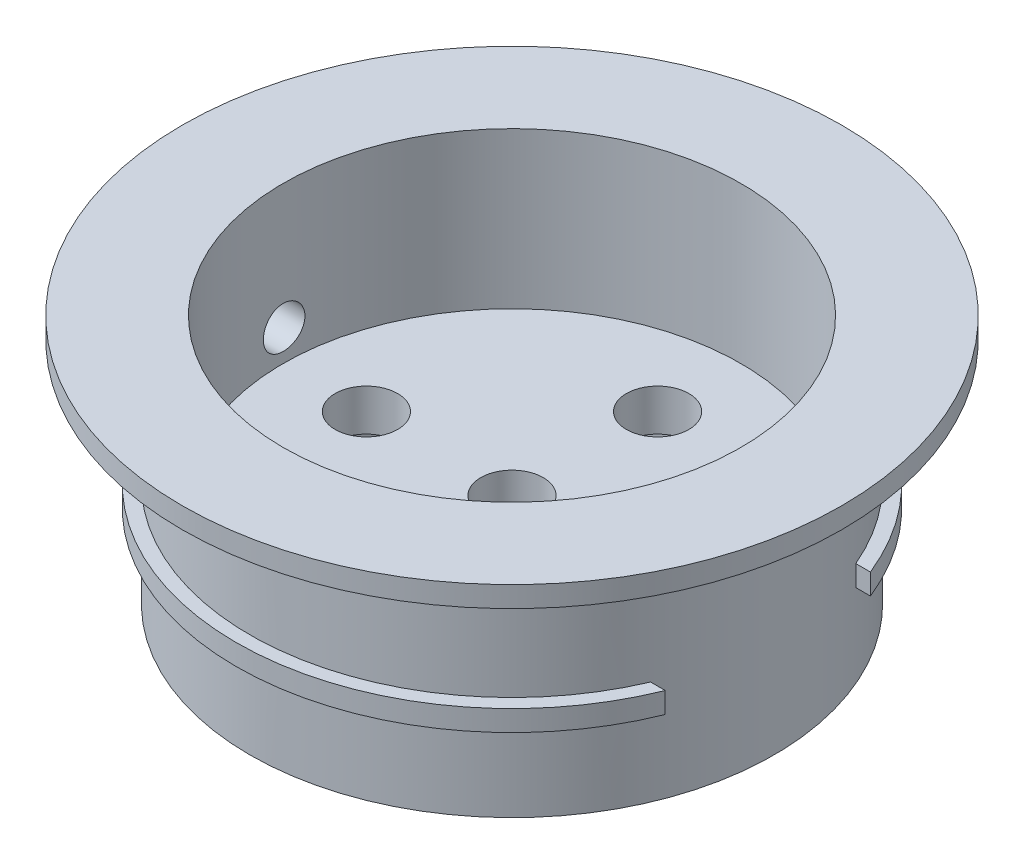
ISO-10303-21;
HEADER;
FILE_DESCRIPTION(('STEP AP214'),'2;1');
FILE_NAME('part.step','',(''),(''),'','','');
FILE_SCHEMA(('AUTOMOTIVE_DESIGN { 1 0 10303 214 1 1 1 1 }'));
ENDSEC;
DATA;
#1=APPLICATION_CONTEXT('core data for automotive mechanical design processes');
#2=APPLICATION_PROTOCOL_DEFINITION('international standard','automotive_design',2000,#1);
#3=PRODUCT_CONTEXT('',#1,'mechanical');
#4=PRODUCT('Part','Part','',(#3));
#5=PRODUCT_RELATED_PRODUCT_CATEGORY('part','',(#4));
#6=PRODUCT_DEFINITION_FORMATION('','',#4);
#7=PRODUCT_DEFINITION_CONTEXT('part definition',#1,'design');
#8=PRODUCT_DEFINITION('design','',#6,#7);
#9=PRODUCT_DEFINITION_SHAPE('','',#8);
#10=(LENGTH_UNIT() NAMED_UNIT(*) SI_UNIT(.MILLI.,.METRE.));
#11=(NAMED_UNIT(*) PLANE_ANGLE_UNIT() SI_UNIT($,.RADIAN.));
#12=(NAMED_UNIT(*) SI_UNIT($,.STERADIAN.) SOLID_ANGLE_UNIT());
#13=UNCERTAINTY_MEASURE_WITH_UNIT(LENGTH_MEASURE(1.E-05),#10,'distance_accuracy_value','');
#14=(GEOMETRIC_REPRESENTATION_CONTEXT(3) GLOBAL_UNCERTAINTY_ASSIGNED_CONTEXT((#13)) GLOBAL_UNIT_ASSIGNED_CONTEXT((#10,
#11,#12)) REPRESENTATION_CONTEXT('',''));
#15=CARTESIAN_POINT('',(0.,0.,0.));
#16=DIRECTION('',(0.,0.,1.));
#17=DIRECTION('',(1.,0.,0.));
#18=AXIS2_PLACEMENT_3D('',#15,#16,#17);
#19=CARTESIAN_POINT('',(0.,12.,0.));
#20=DIRECTION('',(0.,-1.,0.));
#21=DIRECTION('',(0.,0.,-1.));
#22=AXIS2_PLACEMENT_3D('',#19,#20,#21);
#23=CYLINDRICAL_SURFACE('',#22,15.85);
#24=CARTESIAN_POINT('',(0.,12.,0.));
#25=DIRECTION('',(0.,1.,0.));
#26=DIRECTION('',(0.,0.,1.));
#27=AXIS2_PLACEMENT_3D('',#24,#25,#26);
#28=CIRCLE('',#27,15.85);
#29=CARTESIAN_POINT('',(0.,12.,15.85));
#30=VERTEX_POINT('',#29);
#31=EDGE_CURVE('E149',#30,#30,#28,.T.);
#32=ORIENTED_EDGE('',*,*,#31,.F.);
#33=EDGE_LOOP('',(#32));
#34=FACE_BOUND('',#33,.T.);
#35=CARTESIAN_POINT('',(0.,11.,0.));
#36=DIRECTION('',(0.,-1.,0.));
#37=DIRECTION('',(0.,0.,-1.));
#38=AXIS2_PLACEMENT_3D('',#35,#36,#37);
#39=CIRCLE('',#38,15.85);
#40=CARTESIAN_POINT('',(0.,11.,-15.85));
#41=VERTEX_POINT('',#40);
#42=EDGE_CURVE('E116',#41,#41,#39,.T.);
#43=ORIENTED_EDGE('',*,*,#42,.F.);
#44=EDGE_LOOP('',(#43));
#45=FACE_BOUND('',#44,.T.);
#46=ADVANCED_FACE('F36',(#34,#45),#23,.T.);
#47=CARTESIAN_POINT('',(0.,0.,0.));
#48=DIRECTION('',(0.,1.,0.));
#49=DIRECTION('',(0.,0.,1.));
#50=AXIS2_PLACEMENT_3D('',#47,#48,#49);
#51=PLANE('',#50);
#52=CARTESIAN_POINT('',(0.,0.,0.));
#53=DIRECTION('',(0.,-1.,0.));
#54=DIRECTION('',(0.,0.,-1.));
#55=AXIS2_PLACEMENT_3D('',#52,#53,#54);
#56=CIRCLE('',#55,10.1);
#57=CARTESIAN_POINT('',(0.,0.,-10.1));
#58=VERTEX_POINT('',#57);
#59=EDGE_CURVE('E141',#58,#58,#56,.T.);
#60=ORIENTED_EDGE('',*,*,#59,.F.);
#61=EDGE_LOOP('',(#60));
#62=FACE_BOUND('',#61,.T.);
#63=CARTESIAN_POINT('',(0.,0.,0.));
#64=DIRECTION('',(0.,-1.,0.));
#65=DIRECTION('',(0.,0.,-1.));
#66=AXIS2_PLACEMENT_3D('',#63,#64,#65);
#67=CIRCLE('',#66,12.6);
#68=CARTESIAN_POINT('',(0.,0.,-12.6));
#69=VERTEX_POINT('',#68);
#70=EDGE_CURVE('E119',#69,#69,#67,.T.);
#71=ORIENTED_EDGE('',*,*,#70,.T.);
#72=EDGE_LOOP('',(#71));
#73=FACE_BOUND('',#72,.T.);
#74=ADVANCED_FACE('F222',(#62,#73),#51,.F.);
#75=CARTESIAN_POINT('',(0.,12.,0.));
#76=DIRECTION('',(0.,1.,0.));
#77=DIRECTION('',(0.,0.,1.));
#78=AXIS2_PLACEMENT_3D('',#75,#76,#77);
#79=PLANE('',#78);
#80=CARTESIAN_POINT('',(0.,12.,0.));
#81=DIRECTION('',(0.,1.,0.));
#82=DIRECTION('',(0.,0.,1.));
#83=AXIS2_PLACEMENT_3D('',#80,#81,#82);
#84=CIRCLE('',#83,11.);
#85=CARTESIAN_POINT('',(0.,12.,11.));
#86=VERTEX_POINT('',#85);
#87=EDGE_CURVE('E142',#86,#86,#84,.T.);
#88=ORIENTED_EDGE('',*,*,#87,.F.);
#89=EDGE_LOOP('',(#88));
#90=FACE_BOUND('',#89,.T.);
#91=ORIENTED_EDGE('',*,*,#31,.T.);
#92=EDGE_LOOP('',(#91));
#93=FACE_BOUND('',#92,.T.);
#94=ADVANCED_FACE('F227',(#90,#93),#79,.T.);
#95=CARTESIAN_POINT('',(0.,2.5,0.));
#96=DIRECTION('',(0.,-1.,0.));
#97=DIRECTION('',(0.,0.,-1.));
#98=AXIS2_PLACEMENT_3D('',#95,#96,#97);
#99=CYLINDRICAL_SURFACE('',#98,10.1);
#100=CARTESIAN_POINT('',(0.,2.5,0.));
#101=DIRECTION('',(0.,-1.,0.));
#102=DIRECTION('',(0.,0.,-1.));
#103=AXIS2_PLACEMENT_3D('',#100,#101,#102);
#104=CIRCLE('',#103,10.1);
#105=CARTESIAN_POINT('',(0.,2.5,-10.1));
#106=VERTEX_POINT('',#105);
#107=EDGE_CURVE('E146',#106,#106,#104,.T.);
#108=ORIENTED_EDGE('',*,*,#107,.F.);
#109=EDGE_LOOP('',(#108));
#110=FACE_BOUND('',#109,.T.);
#111=ORIENTED_EDGE('',*,*,#59,.T.);
#112=EDGE_LOOP('',(#111));
#113=FACE_BOUND('',#112,.T.);
#114=ADVANCED_FACE('F234',(#110,#113),#99,.F.);
#115=CARTESIAN_POINT('',(0.,2.5,0.));
#116=DIRECTION('',(0.,-1.,0.));
#117=DIRECTION('',(0.,0.,-1.));
#118=AXIS2_PLACEMENT_3D('',#115,#116,#117);
#119=PLANE('',#118);
#120=CARTESIAN_POINT('',(0.,2.5,0.));
#121=DIRECTION('',(0.,-1.,0.));
#122=DIRECTION('',(0.,0.,-1.));
#123=AXIS2_PLACEMENT_3D('',#120,#121,#122);
#124=CIRCLE('',#123,1.5);
#125=CARTESIAN_POINT('',(0.,2.5,-1.5));
#126=VERTEX_POINT('',#125);
#127=EDGE_CURVE('E127',#126,#126,#124,.T.);
#128=ORIENTED_EDGE('',*,*,#127,.F.);
#129=EDGE_LOOP('',(#128));
#130=FACE_BOUND('',#129,.T.);
#131=CARTESIAN_POINT('',(0.,2.5,7.));
#132=DIRECTION('',(0.,-1.,0.));
#133=DIRECTION('',(0.,0.,-1.));
#134=AXIS2_PLACEMENT_3D('',#131,#132,#133);
#135=CIRCLE('',#134,1.5);
#136=CARTESIAN_POINT('',(0.,2.5,5.5));
#137=VERTEX_POINT('',#136);
#138=EDGE_CURVE('E123',#137,#137,#135,.T.);
#139=ORIENTED_EDGE('',*,*,#138,.F.);
#140=EDGE_LOOP('',(#139));
#141=FACE_BOUND('',#140,.T.);
#142=CARTESIAN_POINT('',(-6.9999999999998,2.5,-1.98523339633126E-13));
#143=DIRECTION('',(0.,-1.,0.));
#144=DIRECTION('',(0.,0.,-1.));
#145=AXIS2_PLACEMENT_3D('',#142,#143,#144);
#146=CIRCLE('',#145,1.50000000000032);
#147=CARTESIAN_POINT('',(-6.9999999999998,2.5,-1.50000000000052));
#148=VERTEX_POINT('',#147);
#149=EDGE_CURVE('E122',#148,#148,#146,.T.);
#150=ORIENTED_EDGE('',*,*,#149,.F.);
#151=EDGE_LOOP('',(#150));
#152=FACE_BOUND('',#151,.T.);
#153=CARTESIAN_POINT('',(3.95332173747447E-13,2.5,-7.));
#154=DIRECTION('',(0.,-1.,0.));
#155=DIRECTION('',(0.,0.,-1.));
#156=AXIS2_PLACEMENT_3D('',#153,#154,#155);
#157=CIRCLE('',#156,1.50000000000042);
#158=CARTESIAN_POINT('',(3.95332173747447E-13,2.5,-8.50000000000043));
#159=VERTEX_POINT('',#158);
#160=EDGE_CURVE('E128',#159,#159,#157,.T.);
#161=ORIENTED_EDGE('',*,*,#160,.F.);
#162=EDGE_LOOP('',(#161));
#163=FACE_BOUND('',#162,.T.);
#164=CARTESIAN_POINT('',(7.0000000000002,2.5,1.97666086873723E-13));
#165=DIRECTION('',(0.,-1.,0.));
#166=DIRECTION('',(0.,0.,-1.));
#167=AXIS2_PLACEMENT_3D('',#164,#165,#166);
#168=CIRCLE('',#167,1.50000000000015);
#169=CARTESIAN_POINT('',(7.0000000000002,2.5,-1.49999999999996));
#170=VERTEX_POINT('',#169);
#171=EDGE_CURVE('E131',#170,#170,#168,.T.);
#172=ORIENTED_EDGE('',*,*,#171,.F.);
#173=EDGE_LOOP('',(#172));
#174=FACE_BOUND('',#173,.T.);
#175=ORIENTED_EDGE('',*,*,#107,.T.);
#176=EDGE_LOOP('',(#175));
#177=FACE_BOUND('',#176,.T.);
#178=ADVANCED_FACE('F240',(#130,#141,#152,#163,#174,#177),#119,.T.);
#179=CARTESIAN_POINT('',(0.,4.5,0.));
#180=DIRECTION('',(0.,1.,0.));
#181=DIRECTION('',(0.,0.,1.));
#182=AXIS2_PLACEMENT_3D('',#179,#180,#181);
#183=CYLINDRICAL_SURFACE('',#182,11.);
#184=CARTESIAN_POINT('',(-10.9544511501033,6.,-1.));
#185=CARTESIAN_POINT('',(-10.9544517508113,5.94395422117873,-0.999997560254833));
#186=CARTESIAN_POINT('',(-10.9548858995989,5.88787076114364,-0.995272447261056));
#187=CARTESIAN_POINT('',(-10.9565754722183,5.77725696908135,-0.976493404516689));
#188=CARTESIAN_POINT('',(-10.9578318155864,5.72272844742631,-0.9624290295449));
#189=CARTESIAN_POINT('',(-10.9610223176075,5.61684251592508,-0.92538279637486));
#190=CARTESIAN_POINT('',(-10.962956080414,5.56548327469665,-0.902406145177949));
#191=CARTESIAN_POINT('',(-10.9672830433453,5.4673621237684,-0.848197172713507));
#192=CARTESIAN_POINT('',(-10.9696761482379,5.42059926416608,-0.816966562177037));
#193=CARTESIAN_POINT('',(-10.9746602823738,5.33284491591887,-0.747034272072862));
#194=CARTESIAN_POINT('',(-10.9772518266651,5.29186928895412,-0.708312723364595));
#195=CARTESIAN_POINT('',(-10.9823361407473,5.21698896857945,-0.624539970629446));
#196=CARTESIAN_POINT('',(-10.9848289061316,5.18308459034042,-0.579488484622182));
#197=CARTESIAN_POINT('',(-10.9894397775055,5.12325540987606,-0.484238836673083));
#198=CARTESIAN_POINT('',(-10.9915572291746,5.09734448630923,-0.434031922755741));
#199=CARTESIAN_POINT('',(-10.9951733171235,5.05432650759608,-0.32995753085958));
#200=CARTESIAN_POINT('',(-10.9966719660691,5.03721927225197,-0.276090127830823));
#201=CARTESIAN_POINT('',(-10.9988779842707,5.01234036453514,-0.166382938207477));
#202=CARTESIAN_POINT('',(-10.9995875448885,5.00454283390201,-0.110549060395157));
#203=CARTESIAN_POINT('',(-11.0001428768677,4.99842471020077,0.00163914303910094));
#204=CARTESIAN_POINT('',(-10.9999886670317,5.0001039108426,0.0579934573054867));
#205=CARTESIAN_POINT('',(-10.9988356349174,5.01287050447706,0.169447419867295));
#206=CARTESIAN_POINT('',(-10.9978393089187,5.02393009158583,0.224550282636002));
#207=CARTESIAN_POINT('',(-10.9951169372367,5.05510024574599,0.332114387619649));
#208=CARTESIAN_POINT('',(-10.9933908835017,5.0752109126655,0.384575600679962));
#209=CARTESIAN_POINT('',(-10.9893988885857,5.12394313149944,0.485455347169492));
#210=CARTESIAN_POINT('',(-10.9871321624821,5.15257707222583,0.533867863586916));
#211=CARTESIAN_POINT('',(-10.9823133884739,5.2175340312951,0.625210298204645));
#212=CARTESIAN_POINT('',(-10.9797613336663,5.25385723568571,0.6681400837057));
#213=CARTESIAN_POINT('',(-10.974647636397,5.33331821116938,0.747461139246577));
#214=CARTESIAN_POINT('',(-10.9720859926448,5.37648015556746,0.783828197606401));
#215=CARTESIAN_POINT('',(-10.9672510825487,5.46830934586043,0.848804248472285));
#216=CARTESIAN_POINT('',(-10.9649778165135,5.51697659764779,0.877413232674569));
#217=CARTESIAN_POINT('',(-10.9609767271737,5.61845261236466,0.926060456943912));
#218=CARTESIAN_POINT('',(-10.9592489904169,5.671262030789,0.946097337230527));
#219=CARTESIAN_POINT('',(-10.9565363289721,5.77951473536384,0.977013122262535));
#220=CARTESIAN_POINT('',(-10.9555513856496,5.83495795540285,0.98789225674986));
#221=CARTESIAN_POINT('',(-10.954438951586,5.94669227298526,1.00015286782754));
#222=CARTESIAN_POINT('',(-10.9543084084628,6.00297963138577,1.00156815482263));
#223=CARTESIAN_POINT('',(-10.9549115004788,6.11499075761654,0.994949560430576));
#224=CARTESIAN_POINT('',(-10.9556451259993,6.17071453171289,0.986915784217658));
#225=CARTESIAN_POINT('',(-10.9578911146059,6.2799189894829,0.961655343166037));
#226=CARTESIAN_POINT('',(-10.9594021332984,6.33340337375596,0.944444546844586));
#227=CARTESIAN_POINT('',(-10.9630315520313,6.4367256308682,0.901334778059244));
#228=CARTESIAN_POINT('',(-10.9651499636291,6.48656343429732,0.87543564027139));
#229=CARTESIAN_POINT('',(-10.9697628742462,6.58133227324635,0.815599185736729));
#230=CARTESIAN_POINT('',(-10.9722584176542,6.62624906582288,0.781639392791683));
#231=CARTESIAN_POINT('',(-10.9773409274578,6.70975670093681,0.706677976316729));
#232=CARTESIAN_POINT('',(-10.9799278957231,6.74834741402037,0.665676208718392));
#233=CARTESIAN_POINT('',(-10.9849109146188,6.8182233620151,0.577648379080085));
#234=CARTESIAN_POINT('',(-10.9873063762702,6.84948659087447,0.530604810821167));
#235=CARTESIAN_POINT('',(-10.9916279546446,6.90366894173859,0.431915671283389));
#236=CARTESIAN_POINT('',(-10.9935540768178,6.92658816063853,0.380270153453551));
#237=CARTESIAN_POINT('',(-10.9967172675743,6.96339432443135,0.273921113239584));
#238=CARTESIAN_POINT('',(-10.9979553634324,6.97729474029852,0.219222284792737));
#239=CARTESIAN_POINT('',(-10.9996071930653,6.99571271706731,0.108255307091475));
#240=CARTESIAN_POINT('',(-11.0000209457081,7.00023049272531,0.0519871937858162));
#241=CARTESIAN_POINT('',(-10.9999774829522,6.9997522227809,-0.0603045280353026));
#242=CARTESIAN_POINT('',(-10.9995234018861,6.99479041437077,-0.116328286752868));
#243=CARTESIAN_POINT('',(-10.9978014810173,6.97556539204199,-0.226743128750865));
#244=CARTESIAN_POINT('',(-10.9965336402942,6.96130216760164,-0.281134210184351));
#245=CARTESIAN_POINT('',(-10.9933263613998,6.92388824573047,-0.386740857088297));
#246=CARTESIAN_POINT('',(-10.9913869827498,6.90073833594277,-0.437956703518489));
#247=CARTESIAN_POINT('',(-10.9870532563506,6.84621196165437,-0.53578076506536));
#248=CARTESIAN_POINT('',(-10.9846589138258,6.81483559161483,-0.582389033080556));
#249=CARTESIAN_POINT('',(-10.9796734621922,6.74461838820537,-0.669850290308724));
#250=CARTESIAN_POINT('',(-10.9770817015369,6.70575212762139,-0.710682828578551));
#251=CARTESIAN_POINT('',(-10.9719990677238,6.62170657729994,-0.785262821067203));
#252=CARTESIAN_POINT('',(-10.9695082190496,6.57652576719651,-0.819008564073467));
#253=CARTESIAN_POINT('',(-10.964903640195,6.48102972265417,-0.878512100284543));
#254=CARTESIAN_POINT('',(-10.9627907357997,6.43070361390451,-0.904252490719368));
#255=CARTESIAN_POINT('',(-10.9591912326929,6.32645781049753,-0.946884076173027));
#256=CARTESIAN_POINT('',(-10.9577039201814,6.27254229319334,-0.963785361996739));
#257=CARTESIAN_POINT('',(-10.9559033088399,6.18192843429865,-0.983993142840087));
#258=CARTESIAN_POINT('',(-10.9553612835581,6.14581143122747,-0.989987638731625));
#259=CARTESIAN_POINT('',(-10.9546350087714,6.07313496711275,-0.99799185679994));
#260=CARTESIAN_POINT('',(-10.9544507580809,6.03657550753557,-1.0000015921791));
#261=CARTESIAN_POINT('',(-10.9544511501033,6.,-1.));
#262=B_SPLINE_CURVE_WITH_KNOTS('',3,(#184,#185,#186,#187,#188,#189,#190,#191,#192,#193,#194,
#195,#196,#197,#198,#199,#200,#201,#202,#203,#204,#205,#206,#207,#208,#209,#210,#211,#212,#213,
#214,#215,#216,#217,#218,#219,#220,#221,#222,#223,#224,#225,#226,#227,#228,#229,#230,#231,#232,
#233,#234,#235,#236,#237,#238,#239,#240,#241,#242,#243,#244,#245,#246,#247,#248,#249,#250,#251,
#252,#253,#254,#255,#256,#257,#258,#259,#260,#261),.UNSPECIFIED.,.T.,.F.,(4,2,2,2,2,2,2,2,2,2,2,
2,2,2,2,2,2,2,2,2,2,2,2,2,2,2,2,2,2,2,2,2,2,2,2,2,2,2,4),(0.,0.168003782557652,
0.336195781161784,0.504289661171319,0.672348729013333,0.840859828634799,1.00937843731933,
1.17818801124541,1.34699412976499,1.51533028026027,1.68366276641801,1.85149800858578,
2.01933510266518,2.18741735383105,2.35550367234285,2.52419796477562,2.69289243776787,
2.86161366060712,3.03033065058212,3.1984445611421,3.36655660050244,3.53437888582246,
3.70220436468859,3.87050341961896,4.03880591811036,4.20760756864074,4.37640725889159,
4.54495423675486,4.71349735675538,4.8814329040551,5.04936864132251,5.21728949757475,
5.38520842574342,5.55370779261807,5.72224779951831,5.89115167368363,6.05986230235814,
6.1695020308698,6.27914139612045),.UNSPECIFIED.);
#263=CARTESIAN_POINT('',(-10.9544511501033,6.,-1.));
#264=VERTEX_POINT('',#263);
#265=EDGE_CURVE('E106',#264,#264,#262,.T.);
#266=ORIENTED_EDGE('',*,*,#265,.T.);
#267=EDGE_LOOP('',(#266));
#268=FACE_BOUND('',#267,.T.);
#269=CARTESIAN_POINT('',(0.,4.5,0.));
#270=DIRECTION('',(0.,1.,0.));
#271=DIRECTION('',(0.,0.,1.));
#272=AXIS2_PLACEMENT_3D('',#269,#270,#271);
#273=CIRCLE('',#272,11.);
#274=CARTESIAN_POINT('',(0.,4.5,11.));
#275=VERTEX_POINT('',#274);
#276=EDGE_CURVE('E138',#275,#275,#273,.T.);
#277=ORIENTED_EDGE('',*,*,#276,.F.);
#278=EDGE_LOOP('',(#277));
#279=FACE_BOUND('',#278,.T.);
#280=ORIENTED_EDGE('',*,*,#87,.T.);
#281=EDGE_LOOP('',(#280));
#282=FACE_BOUND('',#281,.T.);
#283=ADVANCED_FACE('F246',(#268,#279,#282),#183,.F.);
#284=CARTESIAN_POINT('',(0.,4.5,0.));
#285=DIRECTION('',(0.,1.,0.));
#286=DIRECTION('',(0.,0.,1.));
#287=AXIS2_PLACEMENT_3D('',#284,#285,#286);
#288=PLANE('',#287);
#289=CARTESIAN_POINT('',(0.,4.5,7.));
#290=DIRECTION('',(0.,1.,0.));
#291=DIRECTION('',(0.,0.,1.));
#292=AXIS2_PLACEMENT_3D('',#289,#290,#291);
#293=CIRCLE('',#292,1.5);
#294=CARTESIAN_POINT('',(0.,4.5,8.5));
#295=VERTEX_POINT('',#294);
#296=EDGE_CURVE('E145',#295,#295,#293,.T.);
#297=ORIENTED_EDGE('',*,*,#296,.F.);
#298=EDGE_LOOP('',(#297));
#299=FACE_BOUND('',#298,.T.);
#300=CARTESIAN_POINT('',(-6.9999999999998,4.5,-1.98523339633126E-13));
#301=DIRECTION('',(0.,1.,0.));
#302=DIRECTION('',(0.,0.,1.));
#303=AXIS2_PLACEMENT_3D('',#300,#301,#302);
#304=CIRCLE('',#303,1.50000000000032);
#305=CARTESIAN_POINT('',(-6.9999999999998,4.5,1.50000000000012));
#306=VERTEX_POINT('',#305);
#307=EDGE_CURVE('E163',#306,#306,#304,.T.);
#308=ORIENTED_EDGE('',*,*,#307,.F.);
#309=EDGE_LOOP('',(#308));
#310=FACE_BOUND('',#309,.T.);
#311=CARTESIAN_POINT('',(3.95332173747447E-13,4.5,-7.));
#312=DIRECTION('',(0.,1.,0.));
#313=DIRECTION('',(0.,0.,1.));
#314=AXIS2_PLACEMENT_3D('',#311,#312,#313);
#315=CIRCLE('',#314,1.50000000000042);
#316=CARTESIAN_POINT('',(3.95332173747447E-13,4.5,-5.49999999999957));
#317=VERTEX_POINT('',#316);
#318=EDGE_CURVE('E160',#317,#317,#315,.T.);
#319=ORIENTED_EDGE('',*,*,#318,.F.);
#320=EDGE_LOOP('',(#319));
#321=FACE_BOUND('',#320,.T.);
#322=CARTESIAN_POINT('',(7.0000000000002,4.5,1.97666086873723E-13));
#323=DIRECTION('',(0.,1.,0.));
#324=DIRECTION('',(0.,0.,1.));
#325=AXIS2_PLACEMENT_3D('',#322,#323,#324);
#326=CIRCLE('',#325,1.50000000000015);
#327=CARTESIAN_POINT('',(7.0000000000002,4.5,1.50000000000035));
#328=VERTEX_POINT('',#327);
#329=EDGE_CURVE('E157',#328,#328,#326,.T.);
#330=ORIENTED_EDGE('',*,*,#329,.F.);
#331=EDGE_LOOP('',(#330));
#332=FACE_BOUND('',#331,.T.);
#333=CARTESIAN_POINT('',(0.,4.5,0.));
#334=DIRECTION('',(0.,1.,0.));
#335=DIRECTION('',(0.,0.,1.));
#336=AXIS2_PLACEMENT_3D('',#333,#334,#335);
#337=CIRCLE('',#336,1.5);
#338=CARTESIAN_POINT('',(0.,4.5,1.5));
#339=VERTEX_POINT('',#338);
#340=EDGE_CURVE('E126',#339,#339,#337,.T.);
#341=ORIENTED_EDGE('',*,*,#340,.F.);
#342=EDGE_LOOP('',(#341));
#343=FACE_BOUND('',#342,.T.);
#344=ORIENTED_EDGE('',*,*,#276,.T.);
#345=EDGE_LOOP('',(#344));
#346=FACE_BOUND('',#345,.T.);
#347=ADVANCED_FACE('F251',(#299,#310,#321,#332,#343,#346),#288,.T.);
#348=CARTESIAN_POINT('',(0.,8.5,0.));
#349=DIRECTION('',(0.,-1.,0.));
#350=DIRECTION('',(0.,0.,-1.));
#351=AXIS2_PLACEMENT_3D('',#348,#349,#350);
#352=CYLINDRICAL_SURFACE('',#351,1.5);
#353=ORIENTED_EDGE('',*,*,#340,.T.);
#354=EDGE_LOOP('',(#353));
#355=FACE_BOUND('',#354,.T.);
#356=ORIENTED_EDGE('',*,*,#127,.T.);
#357=EDGE_LOOP('',(#356));
#358=FACE_BOUND('',#357,.T.);
#359=ADVANCED_FACE('F255',(#355,#358),#352,.F.);
#360=CARTESIAN_POINT('',(7.0000000000002,8.5,1.97666086873723E-13));
#361=DIRECTION('',(0.,-1.,0.));
#362=DIRECTION('',(0.,0.,-1.));
#363=AXIS2_PLACEMENT_3D('',#360,#361,#362);
#364=CYLINDRICAL_SURFACE('',#363,1.50000000000015);
#365=ORIENTED_EDGE('',*,*,#329,.T.);
#366=EDGE_LOOP('',(#365));
#367=FACE_BOUND('',#366,.T.);
#368=ORIENTED_EDGE('',*,*,#171,.T.);
#369=EDGE_LOOP('',(#368));
#370=FACE_BOUND('',#369,.T.);
#371=ADVANCED_FACE('F257',(#367,#370),#364,.F.);
#372=CARTESIAN_POINT('',(3.95332173747447E-13,8.5,-7.));
#373=DIRECTION('',(0.,-1.,0.));
#374=DIRECTION('',(0.,0.,-1.));
#375=AXIS2_PLACEMENT_3D('',#372,#373,#374);
#376=CYLINDRICAL_SURFACE('',#375,1.50000000000042);
#377=ORIENTED_EDGE('',*,*,#318,.T.);
#378=EDGE_LOOP('',(#377));
#379=FACE_BOUND('',#378,.T.);
#380=ORIENTED_EDGE('',*,*,#160,.T.);
#381=EDGE_LOOP('',(#380));
#382=FACE_BOUND('',#381,.T.);
#383=ADVANCED_FACE('F260',(#379,#382),#376,.F.);
#384=CARTESIAN_POINT('',(-6.9999999999998,8.5,-1.98523339633126E-13));
#385=DIRECTION('',(0.,-1.,0.));
#386=DIRECTION('',(0.,0.,-1.));
#387=AXIS2_PLACEMENT_3D('',#384,#385,#386);
#388=CYLINDRICAL_SURFACE('',#387,1.50000000000032);
#389=ORIENTED_EDGE('',*,*,#307,.T.);
#390=EDGE_LOOP('',(#389));
#391=FACE_BOUND('',#390,.T.);
#392=ORIENTED_EDGE('',*,*,#149,.T.);
#393=EDGE_LOOP('',(#392));
#394=FACE_BOUND('',#393,.T.);
#395=ADVANCED_FACE('F265',(#391,#394),#388,.F.);
#396=CARTESIAN_POINT('',(0.,8.5,7.));
#397=DIRECTION('',(0.,-1.,0.));
#398=DIRECTION('',(0.,0.,-1.));
#399=AXIS2_PLACEMENT_3D('',#396,#397,#398);
#400=CYLINDRICAL_SURFACE('',#399,1.5);
#401=ORIENTED_EDGE('',*,*,#296,.T.);
#402=EDGE_LOOP('',(#401));
#403=FACE_BOUND('',#402,.T.);
#404=ORIENTED_EDGE('',*,*,#138,.T.);
#405=EDGE_LOOP('',(#404));
#406=FACE_BOUND('',#405,.T.);
#407=ADVANCED_FACE('F219',(#403,#406),#400,.F.);
#408=CARTESIAN_POINT('',(0.,-0.5,0.));
#409=DIRECTION('',(0.,-1.,0.));
#410=DIRECTION('',(0.,0.,-1.));
#411=AXIS2_PLACEMENT_3D('',#408,#409,#410);
#412=CYLINDRICAL_SURFACE('',#411,12.6);
#413=CARTESIAN_POINT('',(0.,5.,0.));
#414=DIRECTION('',(0.,1.,0.));
#415=DIRECTION('',(0.,0.,1.));
#416=AXIS2_PLACEMENT_3D('',#413,#414,#415);
#417=CIRCLE('',#416,12.6);
#418=CARTESIAN_POINT('',(-12.6,5.,0.));
#419=VERTEX_POINT('',#418);
#420=CARTESIAN_POINT('',(11.5945080185319,5.,-4.9322797779728));
#421=VERTEX_POINT('',#420);
#422=EDGE_CURVE('E43',#419,#421,#417,.F.);
#423=ORIENTED_EDGE('',*,*,#422,.F.);
#424=CARTESIAN_POINT('',(-12.5602547744861,6.,-1.));
#425=CARTESIAN_POINT('',(-12.5602553021859,5.94392454598707,-0.999997546398195));
#426=CARTESIAN_POINT('',(-12.5606343409336,5.88781068511151,-0.995267450915893));
#427=CARTESIAN_POINT('',(-12.5621095673084,5.77713488922087,-0.976467456085141));
#428=CARTESIAN_POINT('',(-12.5632065722099,5.7225747968367,-0.962386912676109));
#429=CARTESIAN_POINT('',(-12.5659927022186,5.61662555563061,-0.925295218469996));
#430=CARTESIAN_POINT('',(-12.5676814965039,5.56523465400634,-0.902289056497849));
#431=CARTESIAN_POINT('',(-12.5714605051405,5.46705641414517,-0.8480078963401));
#432=CARTESIAN_POINT('',(-12.5735506323532,5.42026807991618,-0.81673469256109));
#433=CARTESIAN_POINT('',(-12.5779023015518,5.33250110383168,-0.74672790812773));
#434=CARTESIAN_POINT('',(-12.5801641900969,5.2915347138538,-0.707978987564908));
#435=CARTESIAN_POINT('',(-12.5846013410321,5.21667970028108,-0.62415305011643));
#436=CARTESIAN_POINT('',(-12.5867765996713,5.18279138289293,-0.579075759598216));
#437=CARTESIAN_POINT('',(-12.5907986345355,5.12301421135626,-0.483800207129441));
#438=CARTESIAN_POINT('',(-12.5926449771392,5.0971358844106,-0.433595320403371));
#439=CARTESIAN_POINT('',(-12.5957974248537,5.05418062786147,-0.329535967256829));
#440=CARTESIAN_POINT('',(-12.5971035386383,5.03710355694652,-0.275681559448163));
#441=CARTESIAN_POINT('',(-12.599025946953,5.01227063355252,-0.165973244255244));
#442=CARTESIAN_POINT('',(-12.599643701099,5.00449505535668,-0.110123827847337));
#443=CARTESIAN_POINT('',(-12.6001247267843,4.99842487140792,0.00209058717882027));
#444=CARTESIAN_POINT('',(-12.5999880111819,5.00013010407612,0.0584555769939482));
#445=CARTESIAN_POINT('',(-12.5989767085037,5.01295697672451,0.16996742336008));
#446=CARTESIAN_POINT('',(-12.5981037836965,5.02405740372836,0.225116737146525));
#447=CARTESIAN_POINT('',(-12.5957201783069,5.05532659404526,0.332766917384928));
#448=CARTESIAN_POINT('',(-12.5942094921367,5.0754954368095,0.385267760628336));
#449=CARTESIAN_POINT('',(-12.5907174855648,5.12435266227294,0.486198324582209));
#450=CARTESIAN_POINT('',(-12.5887356395189,5.15305056933331,0.534623415934671));
#451=CARTESIAN_POINT('',(-12.5845240997638,5.21814437792982,0.625977333756362));
#452=CARTESIAN_POINT('',(-12.5822944015024,5.25454042086216,0.668906059247342));
#453=CARTESIAN_POINT('',(-12.5778305582864,5.33411696190316,0.748172640147794));
#454=CARTESIAN_POINT('',(-12.5755964180204,5.37731588831917,0.784491998004696));
#455=CARTESIAN_POINT('',(-12.5713816900046,5.46920764357451,0.849366024445549));
#456=CARTESIAN_POINT('',(-12.5694011024366,5.51790047635562,0.877920687458415));
#457=CARTESIAN_POINT('',(-12.5659173209889,5.61941056095075,0.92645392820922));
#458=CARTESIAN_POINT('',(-12.5644141784101,5.67222825521709,0.946431584439048));
#459=CARTESIAN_POINT('',(-12.5620564305204,5.78048273830476,0.977230221438852));
#460=CARTESIAN_POINT('',(-12.561201812858,5.83591947722411,0.988051376598082));
#461=CARTESIAN_POINT('',(-12.5602398378192,5.94767665134445,1.00020650097694));
#462=CARTESIAN_POINT('',(-12.5601304500848,6.00399426615042,1.00156624775303));
#463=CARTESIAN_POINT('',(-12.5606659590934,6.11605666436869,0.994827444403455));
#464=CARTESIAN_POINT('',(-12.5613108494642,6.17180145261617,0.986728974180265));
#465=CARTESIAN_POINT('',(-12.5632803978365,6.28106204121524,0.961325096176311));
#466=CARTESIAN_POINT('',(-12.5646041700519,6.33458064809537,0.944031684619635));
#467=CARTESIAN_POINT('',(-12.5677815846788,6.43795654883043,0.900741005813924));
#468=CARTESIAN_POINT('',(-12.5696352348137,6.48781378930507,0.874743611697338));
#469=CARTESIAN_POINT('',(-12.5736684640726,6.58256974924412,0.814717573122142));
#470=CARTESIAN_POINT('',(-12.5758487374134,6.62745754426293,0.780671730885687));
#471=CARTESIAN_POINT('',(-12.5802871813603,6.71089007932823,0.705540110821527));
#472=CARTESIAN_POINT('',(-12.582545353183,6.74943472025465,0.664454223004399));
#473=CARTESIAN_POINT('',(-12.5868911756239,6.8191746001687,0.57629749084106));
#474=CARTESIAN_POINT('',(-12.588978431071,6.85035310510128,0.529213386205517));
#475=CARTESIAN_POINT('',(-12.5927415520053,6.90436091859014,0.430462962915495));
#476=CARTESIAN_POINT('',(-12.5944174212737,6.92719030388673,0.378796686383137));
#477=CARTESIAN_POINT('',(-12.5971671137949,6.96382301775377,0.272408827809401));
#478=CARTESIAN_POINT('',(-12.598241630494,6.97763674574806,0.217690845262284));
#479=CARTESIAN_POINT('',(-12.5996703551037,6.99588002229329,0.10670330737283));
#480=CARTESIAN_POINT('',(-12.6000245752551,7.00030973031885,0.0504337784143632));
#481=CARTESIAN_POINT('',(-12.599972819088,6.99965743834841,-0.0618944809072479));
#482=CARTESIAN_POINT('',(-12.5995689288718,6.99460154003955,-0.117953365656856));
#483=CARTESIAN_POINT('',(-12.5980504674074,6.97517591937274,-0.228423250747043));
#484=CARTESIAN_POINT('',(-12.5969358951233,6.96080618343857,-0.282834248685477));
#485=CARTESIAN_POINT('',(-12.594121169451,6.9231672852844,-0.388465959228913));
#486=CARTESIAN_POINT('',(-12.5924210424257,6.89989852371169,-0.439686815338115));
#487=CARTESIAN_POINT('',(-12.5886255536984,6.84512516516136,-0.537499106209715));
#488=CARTESIAN_POINT('',(-12.58653019909,6.81362071599624,-0.584090624037853));
#489=CARTESIAN_POINT('',(-12.5821726857062,6.74317242810507,-0.671455125291973));
#490=CARTESIAN_POINT('',(-12.5799101045864,6.7042093284052,-0.712212555975919));
#491=CARTESIAN_POINT('',(-12.5754767213843,6.61998339243466,-0.786624872844502));
#492=CARTESIAN_POINT('',(-12.5733059417097,6.57471902954062,-0.820278032872171));
#493=CARTESIAN_POINT('',(-12.5692978387364,6.47909540459481,-0.879567593171344));
#494=CARTESIAN_POINT('',(-12.5674611010486,6.42872743148099,-0.905189970430309));
#495=CARTESIAN_POINT('',(-12.5643362462863,6.32442454750989,-0.947581496492285));
#496=CARTESIAN_POINT('',(-12.5630474962836,6.27049383530656,-0.964360864403712));
#497=CARTESIAN_POINT('',(-12.5614973232656,6.18020198080296,-0.984297868756975));
#498=CARTESIAN_POINT('',(-12.5610334966631,6.1444222121349,-0.990178386265216));
#499=CARTESIAN_POINT('',(-12.5604120521926,6.07243363758508,-0.998030239720063));
#500=CARTESIAN_POINT('',(-12.5602544335911,6.03622483273126,-1.00000158503068));
#501=CARTESIAN_POINT('',(-12.5602547744861,6.,-1.));
#502=B_SPLINE_CURVE_WITH_KNOTS('',3,(#424,#425,#426,#427,#428,#429,#430,#431,#432,#433,#434,
#435,#436,#437,#438,#439,#440,#441,#442,#443,#444,#445,#446,#447,#448,#449,#450,#451,#452,#453,
#454,#455,#456,#457,#458,#459,#460,#461,#462,#463,#464,#465,#466,#467,#468,#469,#470,#471,#472,
#473,#474,#475,#476,#477,#478,#479,#480,#481,#482,#483,#484,#485,#486,#487,#488,#489,#490,#491,
#492,#493,#494,#495,#496,#497,#498,#499,#500,#501),.UNSPECIFIED.,.T.,.F.,(4,2,2,2,2,2,2,2,2,2,2,
2,2,2,2,2,2,2,2,2,2,2,2,2,2,2,2,2,2,2,2,2,2,2,2,2,2,2,4),(0.,0.168094102836176,
0.336379883967053,0.504571739777184,0.672727118559081,0.841231288476648,1.00974274659581,
1.17847474117989,1.34720402654699,1.51557484899944,1.6839428019623,1.85193161568231,
2.01992190123279,2.18810049005459,2.35628216818009,2.52492752862148,2.69357301006382,
2.86223660613707,3.03089698987185,3.1990976787376,3.36729694666375,3.53527730913294,
3.70326012015771,3.87160517099352,4.03995285219065,4.20867937762321,4.37740435217926,
4.54593435944926,4.71446150265092,4.88252558718445,5.05058991669542,5.21864668059218,
5.38670042844637,5.55519415443592,5.7237287731116,5.89255606107073,6.06118781960474,
6.16977713825726,6.27836619679518),.UNSPECIFIED.);
#503=EDGE_CURVE('E48',#419,#419,#502,.T.);
#504=ORIENTED_EDGE('',*,*,#503,.F.);
#505=CARTESIAN_POINT('',(11.5945080185319,5.,4.9322797779728));
#506=VERTEX_POINT('',#505);
#507=EDGE_CURVE('E11',#506,#419,#417,.F.);
#508=ORIENTED_EDGE('',*,*,#507,.F.);
#509=DIRECTION('',(0.,-1.,0.));
#510=VECTOR('',#509,1.);
#511=CARTESIAN_POINT('',(11.5945080185319,-0.5,4.9322797779728));
#512=LINE('',#511,#510);
#513=CARTESIAN_POINT('',(11.5945080185319,4.,4.9322797779728));
#514=VERTEX_POINT('',#513);
#515=EDGE_CURVE('E170',#506,#514,#512,.T.);
#516=ORIENTED_EDGE('',*,*,#515,.T.);
#517=CARTESIAN_POINT('',(0.,4.,0.));
#518=DIRECTION('',(0.,1.,0.));
#519=DIRECTION('',(0.,0.,1.));
#520=AXIS2_PLACEMENT_3D('',#517,#518,#519);
#521=CIRCLE('',#520,12.6);
#522=CARTESIAN_POINT('',(11.5945080185319,4.,-4.9322797779728));
#523=VERTEX_POINT('',#522);
#524=EDGE_CURVE('E154',#514,#523,#521,.F.);
#525=ORIENTED_EDGE('',*,*,#524,.T.);
#526=DIRECTION('',(0.,-1.,0.));
#527=VECTOR('',#526,1.);
#528=CARTESIAN_POINT('',(11.5945080185319,-0.5,-4.9322797779728));
#529=LINE('',#528,#527);
#530=EDGE_CURVE('E172',#523,#421,#529,.F.);
#531=ORIENTED_EDGE('',*,*,#530,.T.);
#532=EDGE_LOOP('',(#423,#504,#508,#516,#525,#531));
#533=FACE_BOUND('',#532,.T.);
#534=CARTESIAN_POINT('',(0.,9.41228675972855,0.));
#535=DIRECTION('',(0.,-1.,0.));
#536=DIRECTION('',(0.,0.,-1.));
#537=AXIS2_PLACEMENT_3D('',#534,#535,#536);
#538=CIRCLE('',#537,12.6);
#539=CARTESIAN_POINT('',(0.,9.41228675972855,-12.6));
#540=VERTEX_POINT('',#539);
#541=EDGE_CURVE('E93',#540,#540,#538,.T.);
#542=ORIENTED_EDGE('',*,*,#541,.T.);
#543=EDGE_LOOP('',(#542));
#544=FACE_BOUND('',#543,.T.);
#545=ORIENTED_EDGE('',*,*,#70,.F.);
#546=EDGE_LOOP('',(#545));
#547=FACE_BOUND('',#546,.T.);
#548=ADVANCED_FACE('F174',(#533,#544,#547),#412,.T.);
#549=CARTESIAN_POINT('',(0.,11.,15.35));
#550=DIRECTION('',(0.,-1.,0.));
#551=DIRECTION('',(0.,0.,-1.));
#552=AXIS2_PLACEMENT_3D('',#549,#550,#551);
#553=PLANE('',#552);
#554=ORIENTED_EDGE('',*,*,#42,.T.);
#555=EDGE_LOOP('',(#554));
#556=FACE_BOUND('',#555,.T.);
#557=CARTESIAN_POINT('',(0.,11.,0.));
#558=DIRECTION('',(0.,-1.,0.));
#559=DIRECTION('',(0.,0.,-1.));
#560=AXIS2_PLACEMENT_3D('',#557,#558,#559);
#561=CIRCLE('',#560,15.35);
#562=CARTESIAN_POINT('',(0.,11.,-15.35));
#563=VERTEX_POINT('',#562);
#564=EDGE_CURVE('E113',#563,#563,#561,.T.);
#565=ORIENTED_EDGE('',*,*,#564,.F.);
#566=EDGE_LOOP('',(#565));
#567=FACE_BOUND('',#566,.T.);
#568=ADVANCED_FACE('F212',(#556,#567),#553,.T.);
#569=CARTESIAN_POINT('',(0.,9.41228675972855,0.));
#570=DIRECTION('',(0.,1.,0.));
#571=DIRECTION('',(0.,0.,1.));
#572=AXIS2_PLACEMENT_3D('',#569,#570,#571);
#573=CONICAL_SURFACE('',#572,12.6,1.0471975511966);
#574=ORIENTED_EDGE('',*,*,#564,.T.);
#575=EDGE_LOOP('',(#574));
#576=FACE_BOUND('',#575,.T.);
#577=ORIENTED_EDGE('',*,*,#541,.F.);
#578=EDGE_LOOP('',(#577));
#579=FACE_BOUND('',#578,.T.);
#580=ADVANCED_FACE('F210',(#576,#579),#573,.T.);
#581=CARTESIAN_POINT('',(11.4857571013756,5.,-4.9322797779728));
#582=DIRECTION('',(0.,0.,-1.));
#583=DIRECTION('',(-1.,0.,0.));
#584=AXIS2_PLACEMENT_3D('',#581,#582,#583);
#585=PLANE('',#584);
#586=ORIENTED_EDGE('',*,*,#530,.F.);
#587=DIRECTION('',(1.,0.,0.));
#588=VECTOR('',#587,1.);
#589=CARTESIAN_POINT('',(11.4857571013756,4.,-4.9322797779728));
#590=LINE('',#589,#588);
#591=CARTESIAN_POINT('',(12.2977687485088,4.,-4.9322797779728));
#592=VERTEX_POINT('',#591);
#593=EDGE_CURVE('E55',#523,#592,#590,.T.);
#594=ORIENTED_EDGE('',*,*,#593,.T.);
#595=DIRECTION('',(0.,-1.,0.));
#596=VECTOR('',#595,1.);
#597=CARTESIAN_POINT('',(12.2977687485088,5.,-4.9322797779728));
#598=LINE('',#597,#596);
#599=CARTESIAN_POINT('',(12.2977687485088,5.,-4.9322797779728));
#600=VERTEX_POINT('',#599);
#601=EDGE_CURVE('E90',#600,#592,#598,.T.);
#602=ORIENTED_EDGE('',*,*,#601,.F.);
#603=DIRECTION('',(1.,0.,0.));
#604=VECTOR('',#603,1.);
#605=CARTESIAN_POINT('',(11.4857571013756,5.,-4.9322797779728));
#606=LINE('',#605,#604);
#607=EDGE_CURVE('E77',#421,#600,#606,.T.);
#608=ORIENTED_EDGE('',*,*,#607,.F.);
#609=EDGE_LOOP('',(#586,#594,#602,#608));
#610=FACE_BOUND('',#609,.T.);
#611=ADVANCED_FACE('F91',(#610),#585,.F.);
#612=CARTESIAN_POINT('',(0.,5.,0.));
#613=DIRECTION('',(0.,-1.,0.));
#614=DIRECTION('',(0.,0.,-1.));
#615=AXIS2_PLACEMENT_3D('',#612,#613,#614);
#616=CYLINDRICAL_SURFACE('',#615,13.25);
#617=CARTESIAN_POINT('',(0.,4.,0.));
#618=DIRECTION('',(0.,1.,0.));
#619=DIRECTION('',(0.,0.,1.));
#620=AXIS2_PLACEMENT_3D('',#617,#618,#619);
#621=CIRCLE('',#620,13.25);
#622=CARTESIAN_POINT('',(12.2977687485088,4.,4.93227977797279));
#623=VERTEX_POINT('',#622);
#624=EDGE_CURVE('E105',#592,#623,#621,.T.);
#625=ORIENTED_EDGE('',*,*,#624,.T.);
#626=DIRECTION('',(0.,-1.,0.));
#627=VECTOR('',#626,1.);
#628=CARTESIAN_POINT('',(12.2977687485088,5.,4.93227977797279));
#629=LINE('',#628,#627);
#630=CARTESIAN_POINT('',(12.2977687485088,5.,4.93227977797279));
#631=VERTEX_POINT('',#630);
#632=EDGE_CURVE('E94',#631,#623,#629,.T.);
#633=ORIENTED_EDGE('',*,*,#632,.F.);
#634=CARTESIAN_POINT('',(0.,5.,0.));
#635=DIRECTION('',(0.,1.,0.));
#636=DIRECTION('',(0.,0.,1.));
#637=AXIS2_PLACEMENT_3D('',#634,#635,#636);
#638=CIRCLE('',#637,13.25);
#639=EDGE_CURVE('E82',#600,#631,#638,.T.);
#640=ORIENTED_EDGE('',*,*,#639,.F.);
#641=ORIENTED_EDGE('',*,*,#601,.T.);
#642=EDGE_LOOP('',(#625,#633,#640,#641));
#643=FACE_BOUND('',#642,.T.);
#644=ADVANCED_FACE('F96',(#643),#616,.T.);
#645=CARTESIAN_POINT('',(11.4857571013756,5.,4.9322797779728));
#646=DIRECTION('',(0.,0.,1.));
#647=DIRECTION('',(1.,0.,0.));
#648=AXIS2_PLACEMENT_3D('',#645,#646,#647);
#649=PLANE('',#648);
#650=ORIENTED_EDGE('',*,*,#515,.F.);
#651=DIRECTION('',(-1.,0.,0.));
#652=VECTOR('',#651,1.);
#653=CARTESIAN_POINT('',(11.4857571013756,5.,4.9322797779728));
#654=LINE('',#653,#652);
#655=EDGE_CURVE('E99',#631,#506,#654,.T.);
#656=ORIENTED_EDGE('',*,*,#655,.F.);
#657=ORIENTED_EDGE('',*,*,#632,.T.);
#658=DIRECTION('',(-1.,0.,0.));
#659=VECTOR('',#658,1.);
#660=CARTESIAN_POINT('',(11.4857571013756,4.,4.9322797779728));
#661=LINE('',#660,#659);
#662=EDGE_CURVE('E87',#623,#514,#661,.T.);
#663=ORIENTED_EDGE('',*,*,#662,.T.);
#664=EDGE_LOOP('',(#650,#656,#657,#663));
#665=FACE_BOUND('',#664,.T.);
#666=ADVANCED_FACE('F180',(#665),#649,.F.);
#667=CARTESIAN_POINT('',(0.,5.,0.));
#668=DIRECTION('',(0.,1.,0.));
#669=DIRECTION('',(0.,0.,1.));
#670=AXIS2_PLACEMENT_3D('',#667,#668,#669);
#671=PLANE('',#670);
#672=ORIENTED_EDGE('',*,*,#507,.T.);
#673=ORIENTED_EDGE('',*,*,#422,.T.);
#674=ORIENTED_EDGE('',*,*,#607,.T.);
#675=ORIENTED_EDGE('',*,*,#639,.T.);
#676=ORIENTED_EDGE('',*,*,#655,.T.);
#677=EDGE_LOOP('',(#672,#673,#674,#675,#676));
#678=FACE_BOUND('',#677,.T.);
#679=ADVANCED_FACE('F79',(#678),#671,.T.);
#680=CARTESIAN_POINT('',(0.,4.,0.));
#681=DIRECTION('',(0.,1.,0.));
#682=DIRECTION('',(0.,0.,1.));
#683=AXIS2_PLACEMENT_3D('',#680,#681,#682);
#684=PLANE('',#683);
#685=ORIENTED_EDGE('',*,*,#524,.F.);
#686=ORIENTED_EDGE('',*,*,#662,.F.);
#687=ORIENTED_EDGE('',*,*,#624,.F.);
#688=ORIENTED_EDGE('',*,*,#593,.F.);
#689=EDGE_LOOP('',(#685,#686,#687,#688));
#690=FACE_BOUND('',#689,.T.);
#691=ADVANCED_FACE('F178',(#690),#684,.F.);
#692=CARTESIAN_POINT('',(-16.,6.,0.));
#693=DIRECTION('',(1.,0.,0.));
#694=DIRECTION('',(0.,0.,-1.));
#695=AXIS2_PLACEMENT_3D('',#692,#693,#694);
#696=CYLINDRICAL_SURFACE('',#695,1.);
#697=ORIENTED_EDGE('',*,*,#503,.T.);
#698=EDGE_LOOP('',(#697));
#699=FACE_BOUND('',#698,.T.);
#700=ORIENTED_EDGE('',*,*,#265,.F.);
#701=EDGE_LOOP('',(#700));
#702=FACE_BOUND('',#701,.T.);
#703=ADVANCED_FACE('F195',(#699,#702),#696,.F.);
#704=CLOSED_SHELL('',(#46,#74,#94,#114,#178,#283,#347,#359,#371,#383,#395,#407,#548,#568,#580,
#611,#644,#666,#679,#691,#703));
#705=MANIFOLD_SOLID_BREP('B2',#704);
#706=ADVANCED_BREP_SHAPE_REPRESENTATION('',(#18,#705),#14);
#707=SHAPE_DEFINITION_REPRESENTATION(#9,#706);
ENDSEC;
END-ISO-10303-21;
